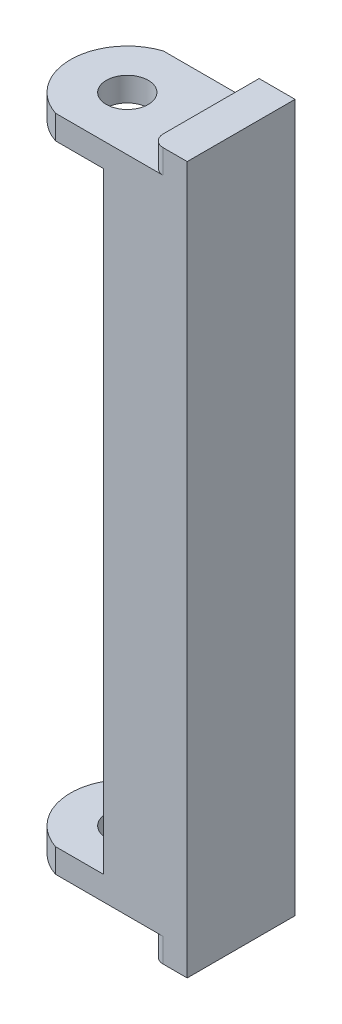
ISO-10303-21;
HEADER;
FILE_DESCRIPTION(('STEP AP214'),'2;1');
FILE_NAME('part.step','',(''),(''),'','','');
FILE_SCHEMA(('AUTOMOTIVE_DESIGN { 1 0 10303 214 1 1 1 1 }'));
ENDSEC;
DATA;
#1=APPLICATION_CONTEXT('core data for automotive mechanical design processes');
#2=APPLICATION_PROTOCOL_DEFINITION('international standard','automotive_design',2000,#1);
#3=PRODUCT_CONTEXT('',#1,'mechanical');
#4=PRODUCT('Part','Part','',(#3));
#5=PRODUCT_RELATED_PRODUCT_CATEGORY('part','',(#4));
#6=PRODUCT_DEFINITION_FORMATION('','',#4);
#7=PRODUCT_DEFINITION_CONTEXT('part definition',#1,'design');
#8=PRODUCT_DEFINITION('design','',#6,#7);
#9=PRODUCT_DEFINITION_SHAPE('','',#8);
#10=(LENGTH_UNIT() NAMED_UNIT(*) SI_UNIT(.MILLI.,.METRE.));
#11=(NAMED_UNIT(*) PLANE_ANGLE_UNIT() SI_UNIT($,.RADIAN.));
#12=(NAMED_UNIT(*) SI_UNIT($,.STERADIAN.) SOLID_ANGLE_UNIT());
#13=UNCERTAINTY_MEASURE_WITH_UNIT(LENGTH_MEASURE(1.E-05),#10,'distance_accuracy_value','');
#14=(GEOMETRIC_REPRESENTATION_CONTEXT(3) GLOBAL_UNCERTAINTY_ASSIGNED_CONTEXT((#13)) GLOBAL_UNIT_ASSIGNED_CONTEXT((#10,
#11,#12)) REPRESENTATION_CONTEXT('',''));
#15=CARTESIAN_POINT('',(0.,0.,0.));
#16=DIRECTION('',(0.,0.,1.));
#17=DIRECTION('',(1.,0.,0.));
#18=AXIS2_PLACEMENT_3D('',#15,#16,#17);
#19=CARTESIAN_POINT('',(0.,0.,0.));
#20=DIRECTION('',(0.,1.,0.));
#21=DIRECTION('',(0.,0.,1.));
#22=AXIS2_PLACEMENT_3D('',#19,#20,#21);
#23=PLANE('',#22);
#24=CARTESIAN_POINT('',(-2.5,0.,0.));
#25=DIRECTION('',(0.,1.,0.));
#26=DIRECTION('',(0.,0.,1.));
#27=AXIS2_PLACEMENT_3D('',#24,#25,#26);
#28=CIRCLE('',#27,1.75);
#29=CARTESIAN_POINT('',(-2.5,0.,1.75));
#30=VERTEX_POINT('',#29);
#31=EDGE_CURVE('E298',#30,#30,#28,.T.);
#32=ORIENTED_EDGE('',*,*,#31,.T.);
#33=EDGE_LOOP('',(#32));
#34=FACE_BOUND('',#33,.T.);
#35=DIRECTION('',(1.,0.,0.));
#36=VECTOR('',#35,1.);
#37=CARTESIAN_POINT('',(0.,0.,-4.5));
#38=LINE('',#37,#36);
#39=CARTESIAN_POINT('',(-3.99100808545272,0.,-4.5));
#40=VERTEX_POINT('',#39);
#41=CARTESIAN_POINT('',(0.00449595727363902,0.,-4.5));
#42=VERTEX_POINT('',#41);
#43=EDGE_CURVE('E309',#40,#42,#38,.T.);
#44=ORIENTED_EDGE('',*,*,#43,.T.);
#45=CARTESIAN_POINT('',(-2.5,0.,0.));
#46=DIRECTION('',(0.,1.,0.));
#47=DIRECTION('',(0.,0.,1.));
#48=AXIS2_PLACEMENT_3D('',#45,#46,#47);
#49=CIRCLE('',#48,5.15);
#50=CARTESIAN_POINT('',(0.00449595727364032,0.,4.5));
#51=VERTEX_POINT('',#50);
#52=EDGE_CURVE('E288',#42,#51,#49,.F.);
#53=ORIENTED_EDGE('',*,*,#52,.T.);
#54=DIRECTION('',(1.,0.,0.));
#55=VECTOR('',#54,1.);
#56=CARTESIAN_POINT('',(0.,0.,4.5));
#57=LINE('',#56,#55);
#58=CARTESIAN_POINT('',(-3.99100808545272,0.,4.5));
#59=VERTEX_POINT('',#58);
#60=EDGE_CURVE('E306',#59,#51,#57,.T.);
#61=ORIENTED_EDGE('',*,*,#60,.F.);
#62=CARTESIAN_POINT('',(-2.5,0.,0.));
#63=DIRECTION('',(0.,1.,0.));
#64=DIRECTION('',(0.,0.,1.));
#65=AXIS2_PLACEMENT_3D('',#62,#63,#64);
#66=CIRCLE('',#65,4.74058067233175);
#67=EDGE_CURVE('E313',#40,#59,#66,.T.);
#68=ORIENTED_EDGE('',*,*,#67,.F.);
#69=EDGE_LOOP('',(#44,#53,#61,#68));
#70=FACE_BOUND('',#69,.T.);
#71=ADVANCED_FACE('F103',(#34,#70),#23,.F.);
#72=CARTESIAN_POINT('',(-2.5,2.,0.));
#73=DIRECTION('',(0.,-1.,0.));
#74=DIRECTION('',(0.,0.,-1.));
#75=AXIS2_PLACEMENT_3D('',#72,#73,#74);
#76=CYLINDRICAL_SURFACE('',#75,1.75);
#77=CARTESIAN_POINT('',(-2.5,2.,0.));
#78=DIRECTION('',(0.,1.,0.));
#79=DIRECTION('',(0.,0.,1.));
#80=AXIS2_PLACEMENT_3D('',#77,#78,#79);
#81=CIRCLE('',#80,1.75);
#82=CARTESIAN_POINT('',(-2.5,2.,1.75));
#83=VERTEX_POINT('',#82);
#84=EDGE_CURVE('E302',#83,#83,#81,.T.);
#85=ORIENTED_EDGE('',*,*,#84,.T.);
#86=EDGE_LOOP('',(#85));
#87=FACE_BOUND('',#86,.T.);
#88=ORIENTED_EDGE('',*,*,#31,.F.);
#89=EDGE_LOOP('',(#88));
#90=FACE_BOUND('',#89,.T.);
#91=ADVANCED_FACE('F373',(#87,#90),#76,.F.);
#92=CARTESIAN_POINT('',(0.,2.,-4.5));
#93=DIRECTION('',(0.,0.,-1.));
#94=DIRECTION('',(-1.,0.,0.));
#95=AXIS2_PLACEMENT_3D('',#92,#93,#94);
#96=PLANE('',#95);
#97=DIRECTION('',(1.,0.,0.));
#98=VECTOR('',#97,1.);
#99=CARTESIAN_POINT('',(0.,2.,-4.5));
#100=LINE('',#99,#98);
#101=CARTESIAN_POINT('',(-3.99100808545272,2.,-4.5));
#102=VERTEX_POINT('',#101);
#103=CARTESIAN_POINT('',(4.,2.,-4.5));
#104=VERTEX_POINT('',#103);
#105=EDGE_CURVE('E297',#102,#104,#100,.T.);
#106=ORIENTED_EDGE('',*,*,#105,.T.);
#107=DIRECTION('',(0.,-1.,0.));
#108=VECTOR('',#107,1.);
#109=CARTESIAN_POINT('',(4.,4.,-4.5));
#110=LINE('',#109,#108);
#111=CARTESIAN_POINT('',(4.,4.,-4.5));
#112=VERTEX_POINT('',#111);
#113=EDGE_CURVE('E282',#112,#104,#110,.T.);
#114=ORIENTED_EDGE('',*,*,#113,.F.);
#115=DIRECTION('',(-1.,0.,0.));
#116=VECTOR('',#115,1.);
#117=CARTESIAN_POINT('',(0.,4.,-4.5));
#118=LINE('',#117,#116);
#119=CARTESIAN_POINT('',(7.,4.,-4.5));
#120=VERTEX_POINT('',#119);
#121=EDGE_CURVE('E274',#120,#112,#118,.T.);
#122=ORIENTED_EDGE('',*,*,#121,.F.);
#123=DIRECTION('',(0.,-1.,0.));
#124=VECTOR('',#123,1.);
#125=CARTESIAN_POINT('',(7.,2.,-4.5));
#126=LINE('',#125,#124);
#127=CARTESIAN_POINT('',(7.,-55.,-4.5));
#128=VERTEX_POINT('',#127);
#129=EDGE_CURVE('E294',#120,#128,#126,.T.);
#130=ORIENTED_EDGE('',*,*,#129,.T.);
#131=DIRECTION('',(-1.,0.,0.));
#132=VECTOR('',#131,1.);
#133=CARTESIAN_POINT('',(0.,-55.,-4.5));
#134=LINE('',#133,#132);
#135=CARTESIAN_POINT('',(4.,-55.,-4.5));
#136=VERTEX_POINT('',#135);
#137=EDGE_CURVE('E347',#128,#136,#134,.T.);
#138=ORIENTED_EDGE('',*,*,#137,.T.);
#139=DIRECTION('',(0.,1.,0.));
#140=VECTOR('',#139,1.);
#141=CARTESIAN_POINT('',(4.,-55.,-4.5));
#142=LINE('',#141,#140);
#143=CARTESIAN_POINT('',(4.,-53.,-4.5));
#144=VERTEX_POINT('',#143);
#145=EDGE_CURVE('E226',#136,#144,#142,.T.);
#146=ORIENTED_EDGE('',*,*,#145,.T.);
#147=DIRECTION('',(1.,0.,0.));
#148=VECTOR('',#147,1.);
#149=CARTESIAN_POINT('',(0.,-53.,-4.5));
#150=LINE('',#149,#148);
#151=CARTESIAN_POINT('',(-3.99100808545272,-53.,-4.5));
#152=VERTEX_POINT('',#151);
#153=EDGE_CURVE('E236',#152,#144,#150,.T.);
#154=ORIENTED_EDGE('',*,*,#153,.F.);
#155=DIRECTION('',(0.,1.,0.));
#156=VECTOR('',#155,1.);
#157=CARTESIAN_POINT('',(-3.99100808545272,-53.,-4.5));
#158=LINE('',#157,#156);
#159=CARTESIAN_POINT('',(-3.99100808545272,-51.,-4.5));
#160=VERTEX_POINT('',#159);
#161=EDGE_CURVE('E258',#152,#160,#158,.T.);
#162=ORIENTED_EDGE('',*,*,#161,.T.);
#163=DIRECTION('',(1.,0.,0.));
#164=VECTOR('',#163,1.);
#165=CARTESIAN_POINT('',(0.,-51.,-4.5));
#166=LINE('',#165,#164);
#167=CARTESIAN_POINT('',(0.00449595727363902,-51.,-4.5));
#168=VERTEX_POINT('',#167);
#169=EDGE_CURVE('E249',#160,#168,#166,.T.);
#170=ORIENTED_EDGE('',*,*,#169,.T.);
#171=DIRECTION('',(0.,1.,0.));
#172=VECTOR('',#171,1.);
#173=CARTESIAN_POINT('',(0.00449595727363902,-25.5,-4.5));
#174=LINE('',#173,#172);
#175=EDGE_CURVE('E291',#168,#42,#174,.T.);
#176=ORIENTED_EDGE('',*,*,#175,.T.);
#177=ORIENTED_EDGE('',*,*,#43,.F.);
#178=DIRECTION('',(0.,-1.,0.));
#179=VECTOR('',#178,1.);
#180=CARTESIAN_POINT('',(-3.99100808545272,2.,-4.5));
#181=LINE('',#180,#179);
#182=EDGE_CURVE('E319',#102,#40,#181,.T.);
#183=ORIENTED_EDGE('',*,*,#182,.F.);
#184=EDGE_LOOP('',(#106,#114,#122,#130,#138,#146,#154,#162,#170,#176,#177,#183));
#185=FACE_BOUND('',#184,.T.);
#186=ADVANCED_FACE('F335',(#185),#96,.T.);
#187=CARTESIAN_POINT('',(-2.5,2.,0.));
#188=DIRECTION('',(0.,-1.,0.));
#189=DIRECTION('',(0.,0.,-1.));
#190=AXIS2_PLACEMENT_3D('',#187,#188,#189);
#191=CYLINDRICAL_SURFACE('',#190,4.74058067233175);
#192=ORIENTED_EDGE('',*,*,#67,.T.);
#193=DIRECTION('',(0.,-1.,0.));
#194=VECTOR('',#193,1.);
#195=CARTESIAN_POINT('',(-3.99100808545272,2.,4.5));
#196=LINE('',#195,#194);
#197=CARTESIAN_POINT('',(-3.99100808545272,2.,4.5));
#198=VERTEX_POINT('',#197);
#199=EDGE_CURVE('E305',#198,#59,#196,.T.);
#200=ORIENTED_EDGE('',*,*,#199,.F.);
#201=CARTESIAN_POINT('',(-2.5,2.,0.));
#202=DIRECTION('',(0.,1.,0.));
#203=DIRECTION('',(0.,0.,1.));
#204=AXIS2_PLACEMENT_3D('',#201,#202,#203);
#205=CIRCLE('',#204,4.74058067233175);
#206=EDGE_CURVE('E300',#102,#198,#205,.T.);
#207=ORIENTED_EDGE('',*,*,#206,.F.);
#208=ORIENTED_EDGE('',*,*,#182,.T.);
#209=EDGE_LOOP('',(#192,#200,#207,#208));
#210=FACE_BOUND('',#209,.T.);
#211=ADVANCED_FACE('F342',(#210),#191,.T.);
#212=CARTESIAN_POINT('',(0.,2.,4.5));
#213=DIRECTION('',(0.,0.,-1.));
#214=DIRECTION('',(-1.,0.,0.));
#215=AXIS2_PLACEMENT_3D('',#212,#213,#214);
#216=PLANE('',#215);
#217=DIRECTION('',(0.,-1.,0.));
#218=VECTOR('',#217,1.);
#219=CARTESIAN_POINT('',(7.,2.,4.5));
#220=LINE('',#219,#218);
#221=CARTESIAN_POINT('',(7.,4.,4.5));
#222=VERTEX_POINT('',#221);
#223=CARTESIAN_POINT('',(7.,-55.,4.5));
#224=VERTEX_POINT('',#223);
#225=EDGE_CURVE('E310',#222,#224,#220,.T.);
#226=ORIENTED_EDGE('',*,*,#225,.F.);
#227=DIRECTION('',(-1.,0.,0.));
#228=VECTOR('',#227,1.);
#229=CARTESIAN_POINT('',(0.,4.,4.5));
#230=LINE('',#229,#228);
#231=CARTESIAN_POINT('',(5.,4.,4.5));
#232=VERTEX_POINT('',#231);
#233=EDGE_CURVE('E268',#222,#232,#230,.T.);
#234=ORIENTED_EDGE('',*,*,#233,.T.);
#235=DIRECTION('',(0.,-1.,0.));
#236=VECTOR('',#235,1.);
#237=CARTESIAN_POINT('',(5.,4.,4.5));
#238=LINE('',#237,#236);
#239=CARTESIAN_POINT('',(5.,2.,4.5));
#240=VERTEX_POINT('',#239);
#241=EDGE_CURVE('E285',#232,#240,#238,.T.);
#242=ORIENTED_EDGE('',*,*,#241,.T.);
#243=DIRECTION('',(1.,0.,0.));
#244=VECTOR('',#243,1.);
#245=CARTESIAN_POINT('',(0.,2.,4.5));
#246=LINE('',#245,#244);
#247=EDGE_CURVE('E123',#198,#240,#246,.T.);
#248=ORIENTED_EDGE('',*,*,#247,.F.);
#249=ORIENTED_EDGE('',*,*,#199,.T.);
#250=ORIENTED_EDGE('',*,*,#60,.T.);
#251=DIRECTION('',(0.,1.,0.));
#252=VECTOR('',#251,1.);
#253=CARTESIAN_POINT('',(0.00449595727364032,-25.5,4.5));
#254=LINE('',#253,#252);
#255=CARTESIAN_POINT('',(0.00449595727364032,-51.,4.5));
#256=VERTEX_POINT('',#255);
#257=EDGE_CURVE('E292',#256,#51,#254,.T.);
#258=ORIENTED_EDGE('',*,*,#257,.F.);
#259=DIRECTION('',(1.,0.,0.));
#260=VECTOR('',#259,1.);
#261=CARTESIAN_POINT('',(0.,-51.,4.5));
#262=LINE('',#261,#260);
#263=CARTESIAN_POINT('',(-3.99100808545272,-51.,4.5));
#264=VERTEX_POINT('',#263);
#265=EDGE_CURVE('E229',#264,#256,#262,.T.);
#266=ORIENTED_EDGE('',*,*,#265,.F.);
#267=DIRECTION('',(0.,1.,0.));
#268=VECTOR('',#267,1.);
#269=CARTESIAN_POINT('',(-3.99100808545272,-53.,4.5));
#270=LINE('',#269,#268);
#271=CARTESIAN_POINT('',(-3.99100808545272,-53.,4.5));
#272=VERTEX_POINT('',#271);
#273=EDGE_CURVE('E246',#272,#264,#270,.T.);
#274=ORIENTED_EDGE('',*,*,#273,.F.);
#275=DIRECTION('',(1.,0.,0.));
#276=VECTOR('',#275,1.);
#277=CARTESIAN_POINT('',(0.,-53.,4.5));
#278=LINE('',#277,#276);
#279=CARTESIAN_POINT('',(5.,-53.,4.5));
#280=VERTEX_POINT('',#279);
#281=EDGE_CURVE('E224',#272,#280,#278,.T.);
#282=ORIENTED_EDGE('',*,*,#281,.T.);
#283=DIRECTION('',(0.,1.,0.));
#284=VECTOR('',#283,1.);
#285=CARTESIAN_POINT('',(5.,-55.,4.5));
#286=LINE('',#285,#284);
#287=CARTESIAN_POINT('',(5.,-55.,4.5));
#288=VERTEX_POINT('',#287);
#289=EDGE_CURVE('E208',#288,#280,#286,.T.);
#290=ORIENTED_EDGE('',*,*,#289,.F.);
#291=DIRECTION('',(-1.,0.,0.));
#292=VECTOR('',#291,1.);
#293=CARTESIAN_POINT('',(0.,-55.,4.5));
#294=LINE('',#293,#292);
#295=EDGE_CURVE('E212',#224,#288,#294,.T.);
#296=ORIENTED_EDGE('',*,*,#295,.F.);
#297=EDGE_LOOP('',(#226,#234,#242,#248,#249,#250,#258,#266,#274,#282,#290,#296));
#298=FACE_BOUND('',#297,.T.);
#299=ADVANCED_FACE('F222',(#298),#216,.F.);
#300=CARTESIAN_POINT('',(0.,2.,0.));
#301=DIRECTION('',(0.,1.,0.));
#302=DIRECTION('',(0.,0.,1.));
#303=AXIS2_PLACEMENT_3D('',#300,#301,#302);
#304=PLANE('',#303);
#305=CARTESIAN_POINT('',(5.,2.,3.5));
#306=DIRECTION('',(0.,1.,0.));
#307=DIRECTION('',(0.,0.,1.));
#308=AXIS2_PLACEMENT_3D('',#305,#306,#307);
#309=CIRCLE('',#308,0.999999999999999);
#310=CARTESIAN_POINT('',(4.,2.,3.5));
#311=VERTEX_POINT('',#310);
#312=EDGE_CURVE('E12',#311,#240,#309,.T.);
#313=ORIENTED_EDGE('',*,*,#312,.F.);
#314=DIRECTION('',(0.,0.,1.));
#315=VECTOR('',#314,1.);
#316=CARTESIAN_POINT('',(4.,2.,0.));
#317=LINE('',#316,#315);
#318=EDGE_CURVE('E111',#104,#311,#317,.T.);
#319=ORIENTED_EDGE('',*,*,#318,.F.);
#320=ORIENTED_EDGE('',*,*,#105,.F.);
#321=ORIENTED_EDGE('',*,*,#206,.T.);
#322=ORIENTED_EDGE('',*,*,#247,.T.);
#323=EDGE_LOOP('',(#313,#319,#320,#321,#322));
#324=FACE_BOUND('',#323,.T.);
#325=ORIENTED_EDGE('',*,*,#84,.F.);
#326=EDGE_LOOP('',(#325));
#327=FACE_BOUND('',#326,.T.);
#328=ADVANCED_FACE('F338',(#324,#327),#304,.T.);
#329=CARTESIAN_POINT('',(7.,2.,4.5));
#330=DIRECTION('',(-1.,0.,0.));
#331=DIRECTION('',(0.,0.,1.));
#332=AXIS2_PLACEMENT_3D('',#329,#330,#331);
#333=PLANE('',#332);
#334=ORIENTED_EDGE('',*,*,#225,.T.);
#335=DIRECTION('',(0.,0.,-1.));
#336=VECTOR('',#335,1.);
#337=CARTESIAN_POINT('',(7.,-55.,0.));
#338=LINE('',#337,#336);
#339=EDGE_CURVE('E219',#224,#128,#338,.T.);
#340=ORIENTED_EDGE('',*,*,#339,.T.);
#341=ORIENTED_EDGE('',*,*,#129,.F.);
#342=DIRECTION('',(0.,0.,-1.));
#343=VECTOR('',#342,1.);
#344=CARTESIAN_POINT('',(7.,4.,0.));
#345=LINE('',#344,#343);
#346=EDGE_CURVE('E271',#222,#120,#345,.T.);
#347=ORIENTED_EDGE('',*,*,#346,.F.);
#348=EDGE_LOOP('',(#334,#340,#341,#347));
#349=FACE_BOUND('',#348,.T.);
#350=ADVANCED_FACE('F105',(#349),#333,.F.);
#351=CARTESIAN_POINT('',(-2.5,-25.5,0.));
#352=DIRECTION('',(0.,1.,0.));
#353=DIRECTION('',(0.,0.,1.));
#354=AXIS2_PLACEMENT_3D('',#351,#352,#353);
#355=CYLINDRICAL_SURFACE('',#354,5.15);
#356=ORIENTED_EDGE('',*,*,#52,.F.);
#357=ORIENTED_EDGE('',*,*,#175,.F.);
#358=CARTESIAN_POINT('',(-2.5,-51.,0.));
#359=DIRECTION('',(0.,1.,0.));
#360=DIRECTION('',(0.,0.,1.));
#361=AXIS2_PLACEMENT_3D('',#358,#359,#360);
#362=CIRCLE('',#361,5.15);
#363=EDGE_CURVE('E225',#168,#256,#362,.F.);
#364=ORIENTED_EDGE('',*,*,#363,.T.);
#365=ORIENTED_EDGE('',*,*,#257,.T.);
#366=EDGE_LOOP('',(#356,#357,#364,#365));
#367=FACE_BOUND('',#366,.T.);
#368=ADVANCED_FACE('F370',(#367),#355,.F.);
#369=CARTESIAN_POINT('',(5.,4.,3.5));
#370=DIRECTION('',(0.,-1.,0.));
#371=DIRECTION('',(0.,0.,-1.));
#372=AXIS2_PLACEMENT_3D('',#369,#370,#371);
#373=CYLINDRICAL_SURFACE('',#372,0.999999999999999);
#374=DIRECTION('',(0.,-1.,0.));
#375=VECTOR('',#374,1.);
#376=CARTESIAN_POINT('',(4.,4.,3.5));
#377=LINE('',#376,#375);
#378=CARTESIAN_POINT('',(4.,4.,3.5));
#379=VERTEX_POINT('',#378);
#380=EDGE_CURVE('E279',#379,#311,#377,.T.);
#381=ORIENTED_EDGE('',*,*,#380,.T.);
#382=ORIENTED_EDGE('',*,*,#312,.T.);
#383=ORIENTED_EDGE('',*,*,#241,.F.);
#384=CARTESIAN_POINT('',(5.,4.,3.5));
#385=DIRECTION('',(0.,1.,0.));
#386=DIRECTION('',(0.,0.,1.));
#387=AXIS2_PLACEMENT_3D('',#384,#385,#386);
#388=CIRCLE('',#387,0.999999999999999);
#389=EDGE_CURVE('E265',#232,#379,#388,.F.);
#390=ORIENTED_EDGE('',*,*,#389,.T.);
#391=EDGE_LOOP('',(#381,#382,#383,#390));
#392=FACE_BOUND('',#391,.T.);
#393=ADVANCED_FACE('F326',(#392),#373,.T.);
#394=CARTESIAN_POINT('',(4.,4.,0.));
#395=DIRECTION('',(-1.,0.,0.));
#396=DIRECTION('',(0.,0.,1.));
#397=AXIS2_PLACEMENT_3D('',#394,#395,#396);
#398=PLANE('',#397);
#399=ORIENTED_EDGE('',*,*,#113,.T.);
#400=ORIENTED_EDGE('',*,*,#318,.T.);
#401=ORIENTED_EDGE('',*,*,#380,.F.);
#402=DIRECTION('',(0.,0.,-1.));
#403=VECTOR('',#402,1.);
#404=CARTESIAN_POINT('',(4.,4.,0.));
#405=LINE('',#404,#403);
#406=EDGE_CURVE('E276',#379,#112,#405,.T.);
#407=ORIENTED_EDGE('',*,*,#406,.T.);
#408=EDGE_LOOP('',(#399,#400,#401,#407));
#409=FACE_BOUND('',#408,.T.);
#410=ADVANCED_FACE('F323',(#409),#398,.T.);
#411=CARTESIAN_POINT('',(0.,4.,0.));
#412=DIRECTION('',(0.,1.,0.));
#413=DIRECTION('',(0.,0.,1.));
#414=AXIS2_PLACEMENT_3D('',#411,#412,#413);
#415=PLANE('',#414);
#416=ORIENTED_EDGE('',*,*,#389,.F.);
#417=ORIENTED_EDGE('',*,*,#233,.F.);
#418=ORIENTED_EDGE('',*,*,#346,.T.);
#419=ORIENTED_EDGE('',*,*,#121,.T.);
#420=ORIENTED_EDGE('',*,*,#406,.F.);
#421=EDGE_LOOP('',(#416,#417,#418,#419,#420));
#422=FACE_BOUND('',#421,.T.);
#423=ADVANCED_FACE('F331',(#422),#415,.T.);
#424=CARTESIAN_POINT('',(0.,-51.,0.));
#425=DIRECTION('',(0.,-1.,0.));
#426=DIRECTION('',(0.,0.,1.));
#427=AXIS2_PLACEMENT_3D('',#424,#425,#426);
#428=PLANE('',#427);
#429=CARTESIAN_POINT('',(-2.5,-51.,0.));
#430=DIRECTION('',(0.,1.,0.));
#431=DIRECTION('',(0.,0.,1.));
#432=AXIS2_PLACEMENT_3D('',#429,#430,#431);
#433=CIRCLE('',#432,1.75);
#434=CARTESIAN_POINT('',(-2.5,-51.,1.75));
#435=VERTEX_POINT('',#434);
#436=EDGE_CURVE('E237',#435,#435,#433,.T.);
#437=ORIENTED_EDGE('',*,*,#436,.F.);
#438=EDGE_LOOP('',(#437));
#439=FACE_BOUND('',#438,.T.);
#440=ORIENTED_EDGE('',*,*,#169,.F.);
#441=CARTESIAN_POINT('',(-2.5,-51.,0.));
#442=DIRECTION('',(0.,1.,0.));
#443=DIRECTION('',(0.,0.,1.));
#444=AXIS2_PLACEMENT_3D('',#441,#442,#443);
#445=CIRCLE('',#444,4.74058067233175);
#446=EDGE_CURVE('E252',#160,#264,#445,.T.);
#447=ORIENTED_EDGE('',*,*,#446,.T.);
#448=ORIENTED_EDGE('',*,*,#265,.T.);
#449=ORIENTED_EDGE('',*,*,#363,.F.);
#450=EDGE_LOOP('',(#440,#447,#448,#449));
#451=FACE_BOUND('',#450,.T.);
#452=ADVANCED_FACE('F367',(#439,#451),#428,.F.);
#453=CARTESIAN_POINT('',(-2.5,-53.,0.));
#454=DIRECTION('',(0.,1.,0.));
#455=DIRECTION('',(0.,0.,-1.));
#456=AXIS2_PLACEMENT_3D('',#453,#454,#455);
#457=CYLINDRICAL_SURFACE('',#456,1.75);
#458=CARTESIAN_POINT('',(-2.5,-53.,0.));
#459=DIRECTION('',(0.,1.,0.));
#460=DIRECTION('',(0.,0.,1.));
#461=AXIS2_PLACEMENT_3D('',#458,#459,#460);
#462=CIRCLE('',#461,1.75);
#463=CARTESIAN_POINT('',(-2.5,-53.,1.75));
#464=VERTEX_POINT('',#463);
#465=EDGE_CURVE('E243',#464,#464,#462,.T.);
#466=ORIENTED_EDGE('',*,*,#465,.F.);
#467=EDGE_LOOP('',(#466));
#468=FACE_BOUND('',#467,.T.);
#469=ORIENTED_EDGE('',*,*,#436,.T.);
#470=EDGE_LOOP('',(#469));
#471=FACE_BOUND('',#470,.T.);
#472=ADVANCED_FACE('F400',(#468,#471),#457,.F.);
#473=CARTESIAN_POINT('',(-2.5,-53.,0.));
#474=DIRECTION('',(0.,1.,0.));
#475=DIRECTION('',(0.,0.,-1.));
#476=AXIS2_PLACEMENT_3D('',#473,#474,#475);
#477=CYLINDRICAL_SURFACE('',#476,4.74058067233175);
#478=ORIENTED_EDGE('',*,*,#446,.F.);
#479=ORIENTED_EDGE('',*,*,#161,.F.);
#480=CARTESIAN_POINT('',(-2.5,-53.,0.));
#481=DIRECTION('',(0.,1.,0.));
#482=DIRECTION('',(0.,0.,1.));
#483=AXIS2_PLACEMENT_3D('',#480,#481,#482);
#484=CIRCLE('',#483,4.74058067233175);
#485=EDGE_CURVE('E240',#152,#272,#484,.T.);
#486=ORIENTED_EDGE('',*,*,#485,.T.);
#487=ORIENTED_EDGE('',*,*,#273,.T.);
#488=EDGE_LOOP('',(#478,#479,#486,#487));
#489=FACE_BOUND('',#488,.T.);
#490=ADVANCED_FACE('F363',(#489),#477,.T.);
#491=CARTESIAN_POINT('',(0.,-53.,0.));
#492=DIRECTION('',(0.,-1.,0.));
#493=DIRECTION('',(0.,0.,1.));
#494=AXIS2_PLACEMENT_3D('',#491,#492,#493);
#495=PLANE('',#494);
#496=CARTESIAN_POINT('',(5.,-53.,3.5));
#497=DIRECTION('',(0.,1.,0.));
#498=DIRECTION('',(0.,0.,1.));
#499=AXIS2_PLACEMENT_3D('',#496,#497,#498);
#500=CIRCLE('',#499,0.999999999999999);
#501=CARTESIAN_POINT('',(4.,-53.,3.5));
#502=VERTEX_POINT('',#501);
#503=EDGE_CURVE('E263',#502,#280,#500,.T.);
#504=ORIENTED_EDGE('',*,*,#503,.T.);
#505=ORIENTED_EDGE('',*,*,#281,.F.);
#506=ORIENTED_EDGE('',*,*,#485,.F.);
#507=ORIENTED_EDGE('',*,*,#153,.T.);
#508=DIRECTION('',(0.,0.,1.));
#509=VECTOR('',#508,1.);
#510=CARTESIAN_POINT('',(4.,-53.,0.));
#511=LINE('',#510,#509);
#512=EDGE_CURVE('E260',#144,#502,#511,.T.);
#513=ORIENTED_EDGE('',*,*,#512,.T.);
#514=EDGE_LOOP('',(#504,#505,#506,#507,#513));
#515=FACE_BOUND('',#514,.T.);
#516=ORIENTED_EDGE('',*,*,#465,.T.);
#517=EDGE_LOOP('',(#516));
#518=FACE_BOUND('',#517,.T.);
#519=ADVANCED_FACE('F357',(#515,#518),#495,.T.);
#520=CARTESIAN_POINT('',(5.,-55.,3.5));
#521=DIRECTION('',(0.,1.,0.));
#522=DIRECTION('',(0.,0.,-1.));
#523=AXIS2_PLACEMENT_3D('',#520,#521,#522);
#524=CYLINDRICAL_SURFACE('',#523,0.999999999999999);
#525=DIRECTION('',(0.,1.,0.));
#526=VECTOR('',#525,1.);
#527=CARTESIAN_POINT('',(4.,-55.,3.5));
#528=LINE('',#527,#526);
#529=CARTESIAN_POINT('',(4.,-55.,3.5));
#530=VERTEX_POINT('',#529);
#531=EDGE_CURVE('E210',#530,#502,#528,.T.);
#532=ORIENTED_EDGE('',*,*,#531,.F.);
#533=CARTESIAN_POINT('',(5.,-55.,3.5));
#534=DIRECTION('',(0.,1.,0.));
#535=DIRECTION('',(0.,0.,1.));
#536=AXIS2_PLACEMENT_3D('',#533,#534,#535);
#537=CIRCLE('',#536,0.999999999999999);
#538=EDGE_CURVE('E203',#288,#530,#537,.F.);
#539=ORIENTED_EDGE('',*,*,#538,.F.);
#540=ORIENTED_EDGE('',*,*,#289,.T.);
#541=ORIENTED_EDGE('',*,*,#503,.F.);
#542=EDGE_LOOP('',(#532,#539,#540,#541));
#543=FACE_BOUND('',#542,.T.);
#544=ADVANCED_FACE('F205',(#543),#524,.T.);
#545=CARTESIAN_POINT('',(4.,-55.,0.));
#546=DIRECTION('',(-1.,0.,0.));
#547=DIRECTION('',(0.,0.,1.));
#548=AXIS2_PLACEMENT_3D('',#545,#546,#547);
#549=PLANE('',#548);
#550=ORIENTED_EDGE('',*,*,#145,.F.);
#551=DIRECTION('',(0.,0.,-1.));
#552=VECTOR('',#551,1.);
#553=CARTESIAN_POINT('',(4.,-55.,0.));
#554=LINE('',#553,#552);
#555=EDGE_CURVE('E350',#530,#136,#554,.T.);
#556=ORIENTED_EDGE('',*,*,#555,.F.);
#557=ORIENTED_EDGE('',*,*,#531,.T.);
#558=ORIENTED_EDGE('',*,*,#512,.F.);
#559=EDGE_LOOP('',(#550,#556,#557,#558));
#560=FACE_BOUND('',#559,.T.);
#561=ADVANCED_FACE('F355',(#560),#549,.T.);
#562=CARTESIAN_POINT('',(0.,-55.,0.));
#563=DIRECTION('',(0.,-1.,0.));
#564=DIRECTION('',(0.,0.,1.));
#565=AXIS2_PLACEMENT_3D('',#562,#563,#564);
#566=PLANE('',#565);
#567=ORIENTED_EDGE('',*,*,#538,.T.);
#568=ORIENTED_EDGE('',*,*,#555,.T.);
#569=ORIENTED_EDGE('',*,*,#137,.F.);
#570=ORIENTED_EDGE('',*,*,#339,.F.);
#571=ORIENTED_EDGE('',*,*,#295,.T.);
#572=EDGE_LOOP('',(#567,#568,#569,#570,#571));
#573=FACE_BOUND('',#572,.T.);
#574=ADVANCED_FACE('F216',(#573),#566,.T.);
#575=CLOSED_SHELL('',(#71,#91,#186,#211,#299,#328,#350,#368,#393,#410,#423,#452,#472,#490,#519,
#544,#561,#574));
#576=MANIFOLD_SOLID_BREP('B2',#575);
#577=ADVANCED_BREP_SHAPE_REPRESENTATION('',(#18,#576),#14);
#578=SHAPE_DEFINITION_REPRESENTATION(#9,#577);
ENDSEC;
END-ISO-10303-21;
